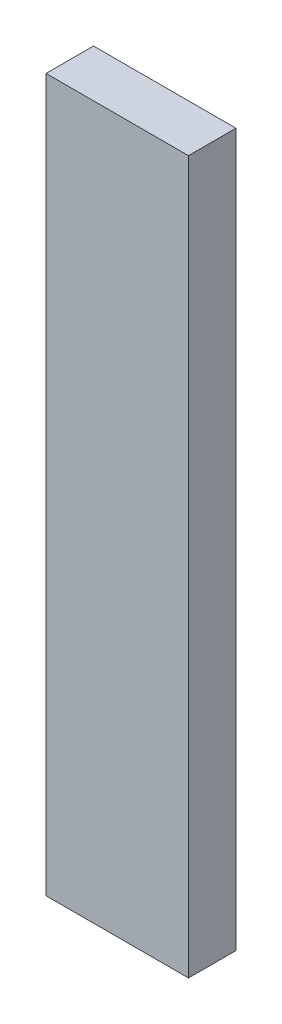
ISO-10303-21;
HEADER;
FILE_DESCRIPTION(('STEP AP214'),'2;1');
FILE_NAME('part.step','',(''),(''),'','','');
FILE_SCHEMA(('AUTOMOTIVE_DESIGN { 1 0 10303 214 1 1 1 1 }'));
ENDSEC;
DATA;
#1=APPLICATION_CONTEXT('core data for automotive mechanical design processes');
#2=APPLICATION_PROTOCOL_DEFINITION('international standard','automotive_design',2000,#1);
#3=PRODUCT_CONTEXT('',#1,'mechanical');
#4=PRODUCT('Part','Part','',(#3));
#5=PRODUCT_RELATED_PRODUCT_CATEGORY('part','',(#4));
#6=PRODUCT_DEFINITION_FORMATION('','',#4);
#7=PRODUCT_DEFINITION_CONTEXT('part definition',#1,'design');
#8=PRODUCT_DEFINITION('design','',#6,#7);
#9=PRODUCT_DEFINITION_SHAPE('','',#8);
#10=(LENGTH_UNIT() NAMED_UNIT(*) SI_UNIT(.MILLI.,.METRE.));
#11=(NAMED_UNIT(*) PLANE_ANGLE_UNIT() SI_UNIT($,.RADIAN.));
#12=(NAMED_UNIT(*) SI_UNIT($,.STERADIAN.) SOLID_ANGLE_UNIT());
#13=UNCERTAINTY_MEASURE_WITH_UNIT(LENGTH_MEASURE(1.E-05),#10,'distance_accuracy_value','');
#14=(GEOMETRIC_REPRESENTATION_CONTEXT(3) GLOBAL_UNCERTAINTY_ASSIGNED_CONTEXT((#13)) GLOBAL_UNIT_ASSIGNED_CONTEXT((#10,
#11,#12)) REPRESENTATION_CONTEXT('',''));
#15=CARTESIAN_POINT('',(0.,0.,0.));
#16=DIRECTION('',(0.,0.,1.));
#17=DIRECTION('',(1.,0.,0.));
#18=AXIS2_PLACEMENT_3D('',#15,#16,#17);
#19=CARTESIAN_POINT('',(0.,0.,0.));
#20=DIRECTION('',(0.,0.,1.));
#21=DIRECTION('',(1.,0.,0.));
#22=AXIS2_PLACEMENT_3D('',#19,#20,#21);
#23=PLANE('',#22);
#24=DIRECTION('',(0.,1.,0.));
#25=VECTOR('',#24,1.);
#26=CARTESIAN_POINT('',(22.9355774860805,-55.4081751278647,0.));
#27=LINE('',#26,#25);
#28=CARTESIAN_POINT('',(22.9355774860805,-55.4081751278647,0.));
#29=VERTEX_POINT('',#28);
#30=CARTESIAN_POINT('',(22.9355774860805,94.5918248721353,0.));
#31=VERTEX_POINT('',#30);
#32=EDGE_CURVE('E254',#29,#31,#27,.T.);
#33=ORIENTED_EDGE('',*,*,#32,.F.);
#34=DIRECTION('',(1.,0.,0.));
#35=VECTOR('',#34,1.);
#36=CARTESIAN_POINT('',(22.9355774860805,-55.4081751278647,0.));
#37=LINE('',#36,#35);
#38=CARTESIAN_POINT('',(-7.06442251391951,-55.4081751278647,0.));
#39=VERTEX_POINT('',#38);
#40=EDGE_CURVE('E69',#39,#29,#37,.T.);
#41=ORIENTED_EDGE('',*,*,#40,.F.);
#42=DIRECTION('',(0.,-1.,0.));
#43=VECTOR('',#42,1.);
#44=CARTESIAN_POINT('',(-7.06442251391951,-55.4081751278647,0.));
#45=LINE('',#44,#43);
#46=CARTESIAN_POINT('',(-7.06442251391951,94.5918248721353,0.));
#47=VERTEX_POINT('',#46);
#48=EDGE_CURVE('E144',#47,#39,#45,.T.);
#49=ORIENTED_EDGE('',*,*,#48,.F.);
#50=DIRECTION('',(-1.,0.,0.));
#51=VECTOR('',#50,1.);
#52=CARTESIAN_POINT('',(22.9355774860805,94.5918248721353,0.));
#53=LINE('',#52,#51);
#54=EDGE_CURVE('E258',#31,#47,#53,.T.);
#55=ORIENTED_EDGE('',*,*,#54,.F.);
#56=EDGE_LOOP('',(#33,#41,#49,#55));
#57=FACE_BOUND('',#56,.T.);
#58=CARTESIAN_POINT('',(7.93557748608049,-28.9081751278647,0.));
#59=DIRECTION('',(0.,0.,1.));
#60=DIRECTION('',(-1.,0.,0.));
#61=AXIS2_PLACEMENT_3D('',#58,#59,#60);
#62=CIRCLE('',#61,6.00000000000001);
#63=CARTESIAN_POINT('',(12.4355774860805,-32.8768020944616,0.));
#64=VERTEX_POINT('',#63);
#65=CARTESIAN_POINT('',(12.4355774860805,-24.9395481612678,0.));
#66=VERTEX_POINT('',#65);
#67=EDGE_CURVE('E61',#64,#66,#62,.T.);
#68=ORIENTED_EDGE('',*,*,#67,.T.);
#69=DIRECTION('',(-0.155245679095351,0.987875892570632,0.));
#70=VECTOR('',#69,1.);
#71=CARTESIAN_POINT('',(12.4355774860805,-24.9395481612678,0.));
#72=LINE('',#71,#70);
#73=CARTESIAN_POINT('',(10.4052672175071,-12.0200609301263,0.));
#74=VERTEX_POINT('',#73);
#75=EDGE_CURVE('E204',#66,#74,#72,.T.);
#76=ORIENTED_EDGE('',*,*,#75,.T.);
#77=CARTESIAN_POINT('',(7.93557748608049,-12.4081751278647,0.));
#78=DIRECTION('',(0.,0.,1.));
#79=DIRECTION('',(1.,0.,0.));
#80=AXIS2_PLACEMENT_3D('',#77,#78,#79);
#81=CIRCLE('',#80,2.5);
#82=CARTESIAN_POINT('',(5.46588775465391,-12.0200609301263,0.));
#83=VERTEX_POINT('',#82);
#84=EDGE_CURVE('E208',#74,#83,#81,.T.);
#85=ORIENTED_EDGE('',*,*,#84,.T.);
#86=DIRECTION('',(-0.155245679095352,-0.987875892570632,0.));
#87=VECTOR('',#86,1.);
#88=CARTESIAN_POINT('',(5.46588775465391,-12.0200609301263,0.));
#89=LINE('',#88,#87);
#90=CARTESIAN_POINT('',(3.43557748608047,-24.9395481612678,0.));
#91=VERTEX_POINT('',#90);
#92=EDGE_CURVE('E212',#83,#91,#89,.T.);
#93=ORIENTED_EDGE('',*,*,#92,.T.);
#94=CARTESIAN_POINT('',(7.93557748608049,-28.9081751278647,0.));
#95=DIRECTION('',(0.,0.,1.));
#96=DIRECTION('',(1.,0.,0.));
#97=AXIS2_PLACEMENT_3D('',#94,#95,#96);
#98=CIRCLE('',#97,6.00000000000001);
#99=CARTESIAN_POINT('',(3.43557748608048,-32.8768020944616,0.));
#100=VERTEX_POINT('',#99);
#101=EDGE_CURVE('E216',#91,#100,#98,.T.);
#102=ORIENTED_EDGE('',*,*,#101,.T.);
#103=DIRECTION('',(0.155245679095353,-0.987875892570632,0.));
#104=VECTOR('',#103,1.);
#105=CARTESIAN_POINT('',(3.43557748608048,-32.8768020944616,0.));
#106=LINE('',#105,#104);
#107=CARTESIAN_POINT('',(5.46588775465391,-45.7962893256031,0.));
#108=VERTEX_POINT('',#107);
#109=EDGE_CURVE('E220',#100,#108,#106,.T.);
#110=ORIENTED_EDGE('',*,*,#109,.T.);
#111=CARTESIAN_POINT('',(7.93557748608049,-45.4081751278647,0.));
#112=DIRECTION('',(0.,0.,1.));
#113=DIRECTION('',(-1.,0.,0.));
#114=AXIS2_PLACEMENT_3D('',#111,#112,#113);
#115=CIRCLE('',#114,2.5);
#116=CARTESIAN_POINT('',(10.4052672175071,-45.7962893256031,0.));
#117=VERTEX_POINT('',#116);
#118=EDGE_CURVE('E224',#108,#117,#115,.T.);
#119=ORIENTED_EDGE('',*,*,#118,.T.);
#120=DIRECTION('',(0.155245679095351,0.987875892570632,0.));
#121=VECTOR('',#120,1.);
#122=CARTESIAN_POINT('',(12.4355774860805,-32.8768020944616,0.));
#123=LINE('',#122,#121);
#124=EDGE_CURVE('E173',#117,#64,#123,.T.);
#125=ORIENTED_EDGE('',*,*,#124,.T.);
#126=EDGE_LOOP('',(#68,#76,#85,#93,#102,#110,#119,#125));
#127=FACE_BOUND('',#126,.T.);
#128=ADVANCED_FACE('F45',(#57,#127),#23,.F.);
#129=CARTESIAN_POINT('',(22.9355774860805,-55.4081751278647,5.));
#130=DIRECTION('',(-1.,0.,0.));
#131=DIRECTION('',(0.,-1.,0.));
#132=AXIS2_PLACEMENT_3D('',#129,#130,#131);
#133=PLANE('',#132);
#134=ORIENTED_EDGE('',*,*,#32,.T.);
#135=DIRECTION('',(0.,0.,-1.));
#136=VECTOR('',#135,1.);
#137=CARTESIAN_POINT('',(22.9355774860805,94.5918248721353,5.));
#138=LINE('',#137,#136);
#139=CARTESIAN_POINT('',(22.9355774860805,94.5918248721353,10.));
#140=VERTEX_POINT('',#139);
#141=EDGE_CURVE('E11',#140,#31,#138,.T.);
#142=ORIENTED_EDGE('',*,*,#141,.F.);
#143=DIRECTION('',(0.,1.,0.));
#144=VECTOR('',#143,1.);
#145=CARTESIAN_POINT('',(22.9355774860805,94.5918248721353,10.));
#146=LINE('',#145,#144);
#147=CARTESIAN_POINT('',(22.9355774860805,-55.4081751278647,10.));
#148=VERTEX_POINT('',#147);
#149=EDGE_CURVE('E155',#148,#140,#146,.T.);
#150=ORIENTED_EDGE('',*,*,#149,.F.);
#151=DIRECTION('',(0.,0.,-1.));
#152=VECTOR('',#151,1.);
#153=CARTESIAN_POINT('',(22.9355774860805,-55.4081751278647,5.));
#154=LINE('',#153,#152);
#155=EDGE_CURVE('E146',#148,#29,#154,.T.);
#156=ORIENTED_EDGE('',*,*,#155,.T.);
#157=EDGE_LOOP('',(#134,#142,#150,#156));
#158=FACE_BOUND('',#157,.T.);
#159=ADVANCED_FACE('F47',(#158),#133,.F.);
#160=CARTESIAN_POINT('',(22.9355774860805,94.5918248721353,5.));
#161=DIRECTION('',(0.,-1.,0.));
#162=DIRECTION('',(0.,0.,-1.));
#163=AXIS2_PLACEMENT_3D('',#160,#161,#162);
#164=PLANE('',#163);
#165=ORIENTED_EDGE('',*,*,#54,.T.);
#166=DIRECTION('',(0.,0.,-1.));
#167=VECTOR('',#166,1.);
#168=CARTESIAN_POINT('',(-7.06442251391951,94.5918248721353,5.));
#169=LINE('',#168,#167);
#170=CARTESIAN_POINT('',(-7.06442251391951,94.5918248721353,10.));
#171=VERTEX_POINT('',#170);
#172=EDGE_CURVE('E54',#171,#47,#169,.T.);
#173=ORIENTED_EDGE('',*,*,#172,.F.);
#174=DIRECTION('',(-1.,0.,0.));
#175=VECTOR('',#174,1.);
#176=CARTESIAN_POINT('',(-7.06442251391951,94.5918248721353,10.));
#177=LINE('',#176,#175);
#178=EDGE_CURVE('E160',#140,#171,#177,.T.);
#179=ORIENTED_EDGE('',*,*,#178,.F.);
#180=ORIENTED_EDGE('',*,*,#141,.T.);
#181=EDGE_LOOP('',(#165,#173,#179,#180));
#182=FACE_BOUND('',#181,.T.);
#183=ADVANCED_FACE('F272',(#182),#164,.F.);
#184=CARTESIAN_POINT('',(-7.06442251391951,-55.4081751278647,5.));
#185=DIRECTION('',(1.,0.,0.));
#186=DIRECTION('',(0.,1.,0.));
#187=AXIS2_PLACEMENT_3D('',#184,#185,#186);
#188=PLANE('',#187);
#189=ORIENTED_EDGE('',*,*,#48,.T.);
#190=DIRECTION('',(0.,0.,-1.));
#191=VECTOR('',#190,1.);
#192=CARTESIAN_POINT('',(-7.06442251391951,-55.4081751278647,5.));
#193=LINE('',#192,#191);
#194=CARTESIAN_POINT('',(-7.06442251391951,-55.4081751278647,10.));
#195=VERTEX_POINT('',#194);
#196=EDGE_CURVE('E137',#195,#39,#193,.T.);
#197=ORIENTED_EDGE('',*,*,#196,.F.);
#198=DIRECTION('',(0.,-1.,0.));
#199=VECTOR('',#198,1.);
#200=CARTESIAN_POINT('',(-7.06442251391951,94.5918248721353,10.));
#201=LINE('',#200,#199);
#202=EDGE_CURVE('E142',#171,#195,#201,.T.);
#203=ORIENTED_EDGE('',*,*,#202,.F.);
#204=ORIENTED_EDGE('',*,*,#172,.T.);
#205=EDGE_LOOP('',(#189,#197,#203,#204));
#206=FACE_BOUND('',#205,.T.);
#207=ADVANCED_FACE('F139',(#206),#188,.F.);
#208=CARTESIAN_POINT('',(22.9355774860805,-55.4081751278647,5.));
#209=DIRECTION('',(0.,1.,0.));
#210=DIRECTION('',(-1.,0.,0.));
#211=AXIS2_PLACEMENT_3D('',#208,#209,#210);
#212=PLANE('',#211);
#213=ORIENTED_EDGE('',*,*,#40,.T.);
#214=ORIENTED_EDGE('',*,*,#155,.F.);
#215=DIRECTION('',(1.,0.,0.));
#216=VECTOR('',#215,1.);
#217=CARTESIAN_POINT('',(-7.06442251391951,-55.4081751278647,10.));
#218=LINE('',#217,#216);
#219=EDGE_CURVE('E149',#195,#148,#218,.T.);
#220=ORIENTED_EDGE('',*,*,#219,.F.);
#221=ORIENTED_EDGE('',*,*,#196,.T.);
#222=EDGE_LOOP('',(#213,#214,#220,#221));
#223=FACE_BOUND('',#222,.T.);
#224=ADVANCED_FACE('F150',(#223),#212,.F.);
#225=CARTESIAN_POINT('',(7.93557748608049,-28.9081751278647,5.));
#226=DIRECTION('',(0.,0.,-1.));
#227=DIRECTION('',(-1.,0.,0.));
#228=AXIS2_PLACEMENT_3D('',#225,#226,#227);
#229=CYLINDRICAL_SURFACE('',#228,6.00000000000001);
#230=ORIENTED_EDGE('',*,*,#67,.F.);
#231=DIRECTION('',(0.,0.,-1.));
#232=VECTOR('',#231,1.);
#233=CARTESIAN_POINT('',(12.4355774860805,-32.8768020944616,5.));
#234=LINE('',#233,#232);
#235=CARTESIAN_POINT('',(12.4355774860805,-32.8768020944616,5.));
#236=VERTEX_POINT('',#235);
#237=EDGE_CURVE('E201',#236,#64,#234,.T.);
#238=ORIENTED_EDGE('',*,*,#237,.F.);
#239=CARTESIAN_POINT('',(7.93557748608049,-28.9081751278647,5.));
#240=DIRECTION('',(0.,0.,1.));
#241=DIRECTION('',(-1.,0.,0.));
#242=AXIS2_PLACEMENT_3D('',#239,#240,#241);
#243=CIRCLE('',#242,6.00000000000001);
#244=CARTESIAN_POINT('',(12.4355774860805,-24.9395481612678,5.));
#245=VERTEX_POINT('',#244);
#246=EDGE_CURVE('E168',#236,#245,#243,.T.);
#247=ORIENTED_EDGE('',*,*,#246,.T.);
#248=DIRECTION('',(0.,0.,-1.));
#249=VECTOR('',#248,1.);
#250=CARTESIAN_POINT('',(12.4355774860805,-24.9395481612678,5.));
#251=LINE('',#250,#249);
#252=EDGE_CURVE('E251',#245,#66,#251,.T.);
#253=ORIENTED_EDGE('',*,*,#252,.T.);
#254=EDGE_LOOP('',(#230,#238,#247,#253));
#255=FACE_BOUND('',#254,.T.);
#256=ADVANCED_FACE('F285',(#255),#229,.F.);
#257=CARTESIAN_POINT('',(12.4355774860805,-24.9395481612678,5.));
#258=DIRECTION('',(-0.987875892570632,-0.155245679095351,0.));
#259=DIRECTION('',(0.155245679095351,-0.987875892570632,0.));
#260=AXIS2_PLACEMENT_3D('',#257,#258,#259);
#261=PLANE('',#260);
#262=ORIENTED_EDGE('',*,*,#75,.F.);
#263=ORIENTED_EDGE('',*,*,#252,.F.);
#264=DIRECTION('',(-0.155245679095351,0.987875892570632,0.));
#265=VECTOR('',#264,1.);
#266=CARTESIAN_POINT('',(12.4355774860805,-24.9395481612678,5.));
#267=LINE('',#266,#265);
#268=CARTESIAN_POINT('',(10.4052672175071,-12.0200609301263,5.));
#269=VERTEX_POINT('',#268);
#270=EDGE_CURVE('E172',#245,#269,#267,.T.);
#271=ORIENTED_EDGE('',*,*,#270,.T.);
#272=DIRECTION('',(0.,0.,-1.));
#273=VECTOR('',#272,1.);
#274=CARTESIAN_POINT('',(10.4052672175071,-12.0200609301263,5.));
#275=LINE('',#274,#273);
#276=EDGE_CURVE('E248',#269,#74,#275,.T.);
#277=ORIENTED_EDGE('',*,*,#276,.T.);
#278=EDGE_LOOP('',(#262,#263,#271,#277));
#279=FACE_BOUND('',#278,.T.);
#280=ADVANCED_FACE('F291',(#279),#261,.T.);
#281=CARTESIAN_POINT('',(7.93557748608049,-12.4081751278647,5.));
#282=DIRECTION('',(0.,0.,-1.));
#283=DIRECTION('',(-1.,0.,0.));
#284=AXIS2_PLACEMENT_3D('',#281,#282,#283);
#285=CYLINDRICAL_SURFACE('',#284,2.5);
#286=ORIENTED_EDGE('',*,*,#84,.F.);
#287=ORIENTED_EDGE('',*,*,#276,.F.);
#288=CARTESIAN_POINT('',(7.93557748608049,-12.4081751278647,5.));
#289=DIRECTION('',(0.,0.,1.));
#290=DIRECTION('',(1.,0.,0.));
#291=AXIS2_PLACEMENT_3D('',#288,#289,#290);
#292=CIRCLE('',#291,2.5);
#293=CARTESIAN_POINT('',(5.46588775465391,-12.0200609301263,5.));
#294=VERTEX_POINT('',#293);
#295=EDGE_CURVE('E177',#269,#294,#292,.T.);
#296=ORIENTED_EDGE('',*,*,#295,.T.);
#297=DIRECTION('',(0.,0.,-1.));
#298=VECTOR('',#297,1.);
#299=CARTESIAN_POINT('',(5.46588775465391,-12.0200609301263,5.));
#300=LINE('',#299,#298);
#301=EDGE_CURVE('E245',#294,#83,#300,.T.);
#302=ORIENTED_EDGE('',*,*,#301,.T.);
#303=EDGE_LOOP('',(#286,#287,#296,#302));
#304=FACE_BOUND('',#303,.T.);
#305=ADVANCED_FACE('F295',(#304),#285,.F.);
#306=CARTESIAN_POINT('',(5.46588775465391,-12.0200609301263,5.));
#307=DIRECTION('',(0.987875892570632,-0.155245679095352,0.));
#308=DIRECTION('',(0.155245679095352,0.987875892570632,0.));
#309=AXIS2_PLACEMENT_3D('',#306,#307,#308);
#310=PLANE('',#309);
#311=ORIENTED_EDGE('',*,*,#92,.F.);
#312=ORIENTED_EDGE('',*,*,#301,.F.);
#313=DIRECTION('',(-0.155245679095352,-0.987875892570632,0.));
#314=VECTOR('',#313,1.);
#315=CARTESIAN_POINT('',(5.46588775465391,-12.0200609301263,5.));
#316=LINE('',#315,#314);
#317=CARTESIAN_POINT('',(3.43557748608047,-24.9395481612678,5.));
#318=VERTEX_POINT('',#317);
#319=EDGE_CURVE('E181',#294,#318,#316,.T.);
#320=ORIENTED_EDGE('',*,*,#319,.T.);
#321=DIRECTION('',(0.,0.,-1.));
#322=VECTOR('',#321,1.);
#323=CARTESIAN_POINT('',(3.43557748608047,-24.9395481612678,5.));
#324=LINE('',#323,#322);
#325=EDGE_CURVE('E242',#318,#91,#324,.T.);
#326=ORIENTED_EDGE('',*,*,#325,.T.);
#327=EDGE_LOOP('',(#311,#312,#320,#326));
#328=FACE_BOUND('',#327,.T.);
#329=ADVANCED_FACE('F300',(#328),#310,.T.);
#330=CARTESIAN_POINT('',(7.93557748608049,-28.9081751278647,5.));
#331=DIRECTION('',(0.,0.,-1.));
#332=DIRECTION('',(-1.,0.,0.));
#333=AXIS2_PLACEMENT_3D('',#330,#331,#332);
#334=CYLINDRICAL_SURFACE('',#333,6.00000000000001);
#335=ORIENTED_EDGE('',*,*,#101,.F.);
#336=ORIENTED_EDGE('',*,*,#325,.F.);
#337=CARTESIAN_POINT('',(7.93557748608049,-28.9081751278647,5.));
#338=DIRECTION('',(0.,0.,1.));
#339=DIRECTION('',(1.,0.,0.));
#340=AXIS2_PLACEMENT_3D('',#337,#338,#339);
#341=CIRCLE('',#340,6.00000000000001);
#342=CARTESIAN_POINT('',(3.43557748608048,-32.8768020944616,5.));
#343=VERTEX_POINT('',#342);
#344=EDGE_CURVE('E185',#318,#343,#341,.T.);
#345=ORIENTED_EDGE('',*,*,#344,.T.);
#346=DIRECTION('',(0.,0.,-1.));
#347=VECTOR('',#346,1.);
#348=CARTESIAN_POINT('',(3.43557748608048,-32.8768020944616,5.));
#349=LINE('',#348,#347);
#350=EDGE_CURVE('E239',#343,#100,#349,.T.);
#351=ORIENTED_EDGE('',*,*,#350,.T.);
#352=EDGE_LOOP('',(#335,#336,#345,#351));
#353=FACE_BOUND('',#352,.T.);
#354=ADVANCED_FACE('F306',(#353),#334,.F.);
#355=CARTESIAN_POINT('',(3.43557748608048,-32.8768020944616,5.));
#356=DIRECTION('',(0.987875892570632,0.155245679095353,0.));
#357=DIRECTION('',(-0.155245679095353,0.987875892570632,0.));
#358=AXIS2_PLACEMENT_3D('',#355,#356,#357);
#359=PLANE('',#358);
#360=ORIENTED_EDGE('',*,*,#109,.F.);
#361=ORIENTED_EDGE('',*,*,#350,.F.);
#362=DIRECTION('',(0.155245679095353,-0.987875892570632,0.));
#363=VECTOR('',#362,1.);
#364=CARTESIAN_POINT('',(3.43557748608048,-32.8768020944616,5.));
#365=LINE('',#364,#363);
#366=CARTESIAN_POINT('',(5.46588775465391,-45.7962893256031,5.));
#367=VERTEX_POINT('',#366);
#368=EDGE_CURVE('E189',#343,#367,#365,.T.);
#369=ORIENTED_EDGE('',*,*,#368,.T.);
#370=DIRECTION('',(0.,0.,-1.));
#371=VECTOR('',#370,1.);
#372=CARTESIAN_POINT('',(5.46588775465391,-45.7962893256031,5.));
#373=LINE('',#372,#371);
#374=EDGE_CURVE('E236',#367,#108,#373,.T.);
#375=ORIENTED_EDGE('',*,*,#374,.T.);
#376=EDGE_LOOP('',(#360,#361,#369,#375));
#377=FACE_BOUND('',#376,.T.);
#378=ADVANCED_FACE('F310',(#377),#359,.T.);
#379=CARTESIAN_POINT('',(7.93557748608049,-45.4081751278647,5.));
#380=DIRECTION('',(0.,0.,-1.));
#381=DIRECTION('',(-1.,0.,0.));
#382=AXIS2_PLACEMENT_3D('',#379,#380,#381);
#383=CYLINDRICAL_SURFACE('',#382,2.5);
#384=ORIENTED_EDGE('',*,*,#118,.F.);
#385=ORIENTED_EDGE('',*,*,#374,.F.);
#386=CARTESIAN_POINT('',(7.93557748608049,-45.4081751278647,5.));
#387=DIRECTION('',(0.,0.,1.));
#388=DIRECTION('',(-1.,0.,0.));
#389=AXIS2_PLACEMENT_3D('',#386,#387,#388);
#390=CIRCLE('',#389,2.5);
#391=CARTESIAN_POINT('',(10.4052672175071,-45.7962893256031,5.));
#392=VERTEX_POINT('',#391);
#393=EDGE_CURVE('E193',#367,#392,#390,.T.);
#394=ORIENTED_EDGE('',*,*,#393,.T.);
#395=DIRECTION('',(0.,0.,-1.));
#396=VECTOR('',#395,1.);
#397=CARTESIAN_POINT('',(10.4052672175071,-45.7962893256031,5.));
#398=LINE('',#397,#396);
#399=EDGE_CURVE('E233',#392,#117,#398,.T.);
#400=ORIENTED_EDGE('',*,*,#399,.T.);
#401=EDGE_LOOP('',(#384,#385,#394,#400));
#402=FACE_BOUND('',#401,.T.);
#403=ADVANCED_FACE('F314',(#402),#383,.F.);
#404=CARTESIAN_POINT('',(12.4355774860805,-32.8768020944616,5.));
#405=DIRECTION('',(-0.987875892570632,0.155245679095351,0.));
#406=DIRECTION('',(-0.155245679095351,-0.987875892570632,0.));
#407=AXIS2_PLACEMENT_3D('',#404,#405,#406);
#408=PLANE('',#407);
#409=ORIENTED_EDGE('',*,*,#124,.F.);
#410=ORIENTED_EDGE('',*,*,#399,.F.);
#411=DIRECTION('',(0.155245679095351,0.987875892570632,0.));
#412=VECTOR('',#411,1.);
#413=CARTESIAN_POINT('',(12.4355774860805,-32.8768020944616,5.));
#414=LINE('',#413,#412);
#415=EDGE_CURVE('E197',#392,#236,#414,.T.);
#416=ORIENTED_EDGE('',*,*,#415,.T.);
#417=ORIENTED_EDGE('',*,*,#237,.T.);
#418=EDGE_LOOP('',(#409,#410,#416,#417));
#419=FACE_BOUND('',#418,.T.);
#420=ADVANCED_FACE('F318',(#419),#408,.T.);
#421=CARTESIAN_POINT('',(0.,0.,5.));
#422=DIRECTION('',(0.,0.,1.));
#423=DIRECTION('',(1.,0.,0.));
#424=AXIS2_PLACEMENT_3D('',#421,#422,#423);
#425=PLANE('',#424);
#426=ORIENTED_EDGE('',*,*,#270,.F.);
#427=ORIENTED_EDGE('',*,*,#246,.F.);
#428=ORIENTED_EDGE('',*,*,#415,.F.);
#429=ORIENTED_EDGE('',*,*,#393,.F.);
#430=ORIENTED_EDGE('',*,*,#368,.F.);
#431=ORIENTED_EDGE('',*,*,#344,.F.);
#432=ORIENTED_EDGE('',*,*,#319,.F.);
#433=ORIENTED_EDGE('',*,*,#295,.F.);
#434=EDGE_LOOP('',(#426,#427,#428,#429,#430,#431,#432,#433));
#435=FACE_BOUND('',#434,.T.);
#436=ADVANCED_FACE('F322',(#435),#425,.F.);
#437=CARTESIAN_POINT('',(0.,0.,10.));
#438=DIRECTION('',(0.,0.,1.));
#439=DIRECTION('',(1.,0.,0.));
#440=AXIS2_PLACEMENT_3D('',#437,#438,#439);
#441=PLANE('',#440);
#442=ORIENTED_EDGE('',*,*,#202,.T.);
#443=ORIENTED_EDGE('',*,*,#219,.T.);
#444=ORIENTED_EDGE('',*,*,#149,.T.);
#445=ORIENTED_EDGE('',*,*,#178,.T.);
#446=EDGE_LOOP('',(#442,#443,#444,#445));
#447=FACE_BOUND('',#446,.T.);
#448=ADVANCED_FACE('F158',(#447),#441,.T.);
#449=CLOSED_SHELL('',(#128,#159,#183,#207,#224,#256,#280,#305,#329,#354,#378,#403,#420,#436,#448));
#450=MANIFOLD_SOLID_BREP('B2',#449);
#451=ADVANCED_BREP_SHAPE_REPRESENTATION('',(#18,#450),#14);
#452=SHAPE_DEFINITION_REPRESENTATION(#9,#451);
ENDSEC;
END-ISO-10303-21;
